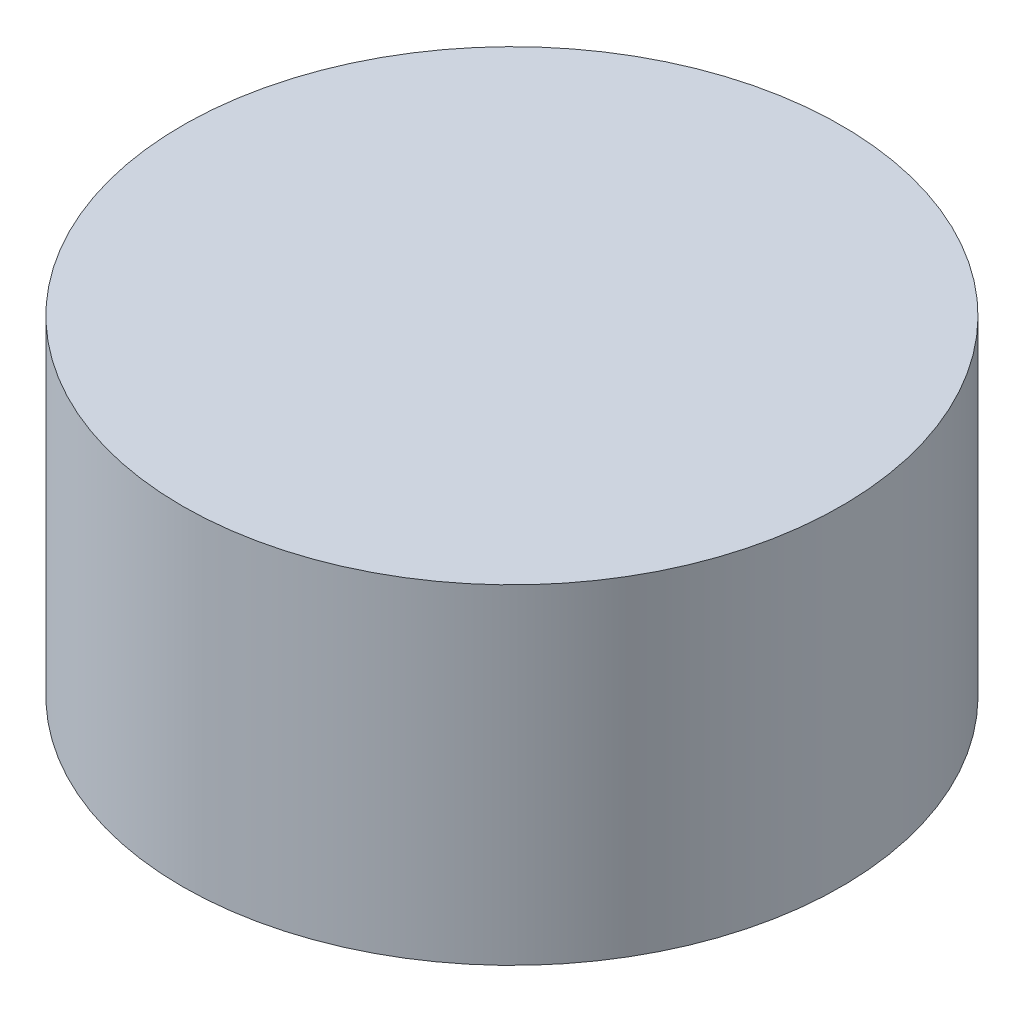
ISO-10303-21;
HEADER;
FILE_DESCRIPTION(('STEP AP214'),'2;1');
FILE_NAME('part.step','',(''),(''),'','','');
FILE_SCHEMA(('AUTOMOTIVE_DESIGN { 1 0 10303 214 1 1 1 1 }'));
ENDSEC;
DATA;
#1=APPLICATION_CONTEXT('core data for automotive mechanical design processes');
#2=APPLICATION_PROTOCOL_DEFINITION('international standard','automotive_design',2000,#1);
#3=PRODUCT_CONTEXT('',#1,'mechanical');
#4=PRODUCT('Part','Part','',(#3));
#5=PRODUCT_RELATED_PRODUCT_CATEGORY('part','',(#4));
#6=PRODUCT_DEFINITION_FORMATION('','',#4);
#7=PRODUCT_DEFINITION_CONTEXT('part definition',#1,'design');
#8=PRODUCT_DEFINITION('design','',#6,#7);
#9=PRODUCT_DEFINITION_SHAPE('','',#8);
#10=(LENGTH_UNIT() NAMED_UNIT(*) SI_UNIT(.MILLI.,.METRE.));
#11=(NAMED_UNIT(*) PLANE_ANGLE_UNIT() SI_UNIT($,.RADIAN.));
#12=(NAMED_UNIT(*) SI_UNIT($,.STERADIAN.) SOLID_ANGLE_UNIT());
#13=UNCERTAINTY_MEASURE_WITH_UNIT(LENGTH_MEASURE(1.E-05),#10,'distance_accuracy_value','');
#14=(GEOMETRIC_REPRESENTATION_CONTEXT(3) GLOBAL_UNCERTAINTY_ASSIGNED_CONTEXT((#13)) GLOBAL_UNIT_ASSIGNED_CONTEXT((#10,
#11,#12)) REPRESENTATION_CONTEXT('',''));
#15=CARTESIAN_POINT('',(0.,0.,0.));
#16=DIRECTION('',(0.,0.,1.));
#17=DIRECTION('',(1.,0.,0.));
#18=AXIS2_PLACEMENT_3D('',#15,#16,#17);
#19=CARTESIAN_POINT('',(0.,60.,0.));
#20=DIRECTION('',(0.,-1.,0.));
#21=DIRECTION('',(0.,0.,-1.));
#22=AXIS2_PLACEMENT_3D('',#19,#20,#21);
#23=CYLINDRICAL_SURFACE('',#22,60.);
#24=CARTESIAN_POINT('',(0.,60.,0.));
#25=DIRECTION('',(0.,1.,0.));
#26=DIRECTION('',(0.,0.,1.));
#27=AXIS2_PLACEMENT_3D('',#24,#25,#26);
#28=CIRCLE('',#27,60.);
#29=CARTESIAN_POINT('',(0.,60.,60.));
#30=VERTEX_POINT('',#29);
#31=EDGE_CURVE('E10',#30,#30,#28,.T.);
#32=ORIENTED_EDGE('',*,*,#31,.F.);
#33=EDGE_LOOP('',(#32));
#34=FACE_BOUND('',#33,.T.);
#35=CARTESIAN_POINT('',(0.,0.,0.));
#36=DIRECTION('',(0.,1.,0.));
#37=DIRECTION('',(0.,0.,1.));
#38=AXIS2_PLACEMENT_3D('',#35,#36,#37);
#39=CIRCLE('',#38,60.);
#40=CARTESIAN_POINT('',(0.,0.,60.));
#41=VERTEX_POINT('',#40);
#42=EDGE_CURVE('E37',#41,#41,#39,.T.);
#43=ORIENTED_EDGE('',*,*,#42,.T.);
#44=EDGE_LOOP('',(#43));
#45=FACE_BOUND('',#44,.T.);
#46=ADVANCED_FACE('F40',(#34,#45),#23,.T.);
#47=CARTESIAN_POINT('',(0.,60.,0.));
#48=DIRECTION('',(0.,1.,0.));
#49=DIRECTION('',(0.,0.,1.));
#50=AXIS2_PLACEMENT_3D('',#47,#48,#49);
#51=PLANE('',#50);
#52=ORIENTED_EDGE('',*,*,#31,.T.);
#53=EDGE_LOOP('',(#52));
#54=FACE_BOUND('',#53,.T.);
#55=ADVANCED_FACE('F55',(#54),#51,.T.);
#56=CARTESIAN_POINT('',(0.,0.,0.));
#57=DIRECTION('',(0.,1.,0.));
#58=DIRECTION('',(0.,0.,1.));
#59=AXIS2_PLACEMENT_3D('',#56,#57,#58);
#60=PLANE('',#59);
#61=ORIENTED_EDGE('',*,*,#42,.F.);
#62=EDGE_LOOP('',(#61));
#63=FACE_BOUND('',#62,.T.);
#64=ADVANCED_FACE('F49',(#63),#60,.F.);
#65=CLOSED_SHELL('',(#46,#55,#64));
#66=MANIFOLD_SOLID_BREP('B2',#65);
#67=ADVANCED_BREP_SHAPE_REPRESENTATION('',(#18,#66),#14);
#68=SHAPE_DEFINITION_REPRESENTATION(#9,#67);
ENDSEC;
END-ISO-10303-21;
